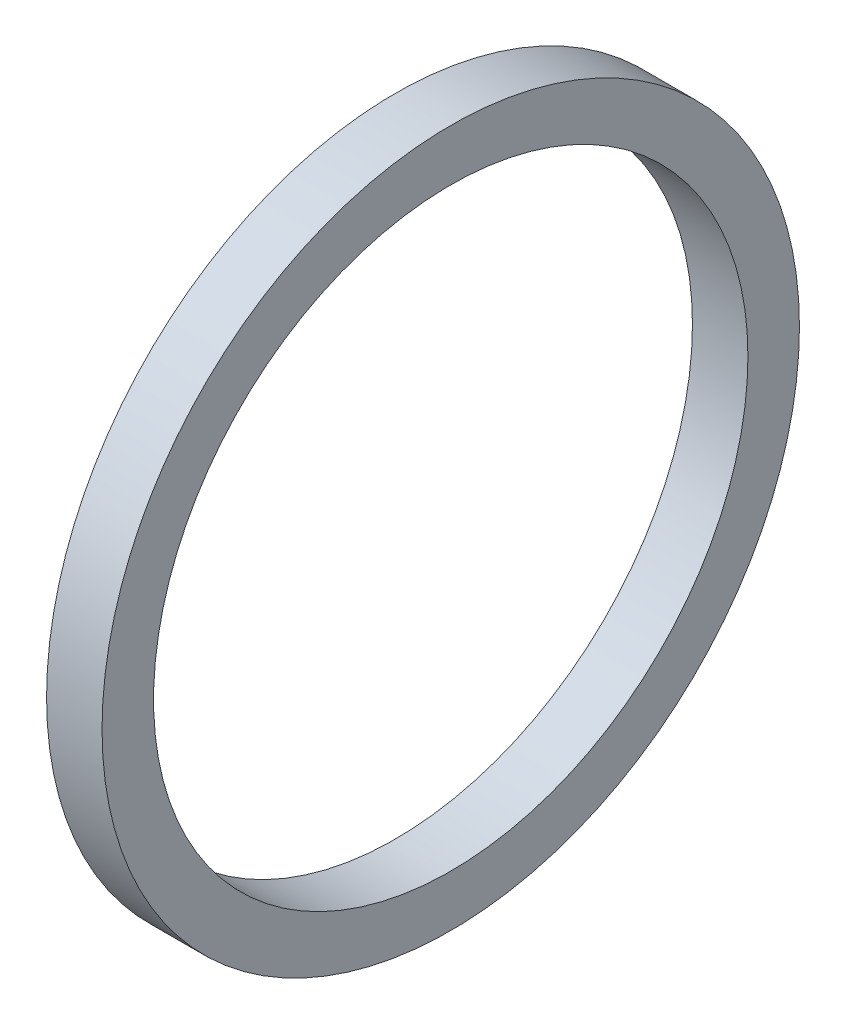
ISO-10303-21;
HEADER;
FILE_DESCRIPTION(('STEP AP214'),'2;1');
FILE_NAME('part.step','',(''),(''),'','','');
FILE_SCHEMA(('AUTOMOTIVE_DESIGN { 1 0 10303 214 1 1 1 1 }'));
ENDSEC;
DATA;
#1=APPLICATION_CONTEXT('core data for automotive mechanical design processes');
#2=APPLICATION_PROTOCOL_DEFINITION('international standard','automotive_design',2000,#1);
#3=PRODUCT_CONTEXT('',#1,'mechanical');
#4=PRODUCT('Part','Part','',(#3));
#5=PRODUCT_RELATED_PRODUCT_CATEGORY('part','',(#4));
#6=PRODUCT_DEFINITION_FORMATION('','',#4);
#7=PRODUCT_DEFINITION_CONTEXT('part definition',#1,'design');
#8=PRODUCT_DEFINITION('design','',#6,#7);
#9=PRODUCT_DEFINITION_SHAPE('','',#8);
#10=(LENGTH_UNIT() NAMED_UNIT(*) SI_UNIT(.MILLI.,.METRE.));
#11=(NAMED_UNIT(*) PLANE_ANGLE_UNIT() SI_UNIT($,.RADIAN.));
#12=(NAMED_UNIT(*) SI_UNIT($,.STERADIAN.) SOLID_ANGLE_UNIT());
#13=UNCERTAINTY_MEASURE_WITH_UNIT(LENGTH_MEASURE(1.E-05),#10,'distance_accuracy_value','');
#14=(GEOMETRIC_REPRESENTATION_CONTEXT(3) GLOBAL_UNCERTAINTY_ASSIGNED_CONTEXT((#13)) GLOBAL_UNIT_ASSIGNED_CONTEXT((#10,
#11,#12)) REPRESENTATION_CONTEXT('',''));
#15=CARTESIAN_POINT('',(0.,0.,0.));
#16=DIRECTION('',(0.,0.,1.));
#17=DIRECTION('',(1.,0.,0.));
#18=AXIS2_PLACEMENT_3D('',#15,#16,#17);
#19=CARTESIAN_POINT('',(7.,0.,0.));
#20=DIRECTION('',(1.,0.,0.));
#21=DIRECTION('',(0.,0.,-1.));
#22=AXIS2_PLACEMENT_3D('',#19,#20,#21);
#23=PLANE('',#22);
#24=CARTESIAN_POINT('',(7.,0.,0.));
#25=DIRECTION('',(1.,0.,0.));
#26=DIRECTION('',(0.,0.,-1.));
#27=AXIS2_PLACEMENT_3D('',#24,#25,#26);
#28=CIRCLE('',#27,44.);
#29=CARTESIAN_POINT('',(7.,0.,-44.));
#30=VERTEX_POINT('',#29);
#31=EDGE_CURVE('E10',#30,#30,#28,.T.);
#32=ORIENTED_EDGE('',*,*,#31,.T.);
#33=EDGE_LOOP('',(#32));
#34=FACE_BOUND('',#33,.T.);
#35=CARTESIAN_POINT('',(7.,0.,0.));
#36=DIRECTION('',(1.,0.,0.));
#37=DIRECTION('',(0.,0.,-1.));
#38=AXIS2_PLACEMENT_3D('',#35,#36,#37);
#39=CIRCLE('',#38,37.5);
#40=CARTESIAN_POINT('',(7.,0.,-37.5));
#41=VERTEX_POINT('',#40);
#42=EDGE_CURVE('E42',#41,#41,#39,.T.);
#43=ORIENTED_EDGE('',*,*,#42,.F.);
#44=EDGE_LOOP('',(#43));
#45=FACE_BOUND('',#44,.T.);
#46=ADVANCED_FACE('F31',(#34,#45),#23,.T.);
#47=CARTESIAN_POINT('',(0.,0.,0.));
#48=DIRECTION('',(1.,0.,0.));
#49=DIRECTION('',(0.,0.,-1.));
#50=AXIS2_PLACEMENT_3D('',#47,#48,#49);
#51=PLANE('',#50);
#52=CARTESIAN_POINT('',(0.,0.,0.));
#53=DIRECTION('',(1.,0.,0.));
#54=DIRECTION('',(0.,0.,-1.));
#55=AXIS2_PLACEMENT_3D('',#52,#53,#54);
#56=CIRCLE('',#55,44.);
#57=CARTESIAN_POINT('',(0.,0.,-44.));
#58=VERTEX_POINT('',#57);
#59=EDGE_CURVE('E35',#58,#58,#56,.T.);
#60=ORIENTED_EDGE('',*,*,#59,.F.);
#61=EDGE_LOOP('',(#60));
#62=FACE_BOUND('',#61,.T.);
#63=CARTESIAN_POINT('',(0.,0.,0.));
#64=DIRECTION('',(1.,0.,0.));
#65=DIRECTION('',(0.,0.,-1.));
#66=AXIS2_PLACEMENT_3D('',#63,#64,#65);
#67=CIRCLE('',#66,37.5);
#68=CARTESIAN_POINT('',(0.,0.,-37.5));
#69=VERTEX_POINT('',#68);
#70=EDGE_CURVE('E44',#69,#69,#67,.T.);
#71=ORIENTED_EDGE('',*,*,#70,.T.);
#72=EDGE_LOOP('',(#71));
#73=FACE_BOUND('',#72,.T.);
#74=ADVANCED_FACE('F54',(#62,#73),#51,.F.);
#75=CARTESIAN_POINT('',(7.,0.,0.));
#76=DIRECTION('',(-1.,0.,0.));
#77=DIRECTION('',(0.,0.,1.));
#78=AXIS2_PLACEMENT_3D('',#75,#76,#77);
#79=CYLINDRICAL_SURFACE('',#78,44.);
#80=ORIENTED_EDGE('',*,*,#31,.F.);
#81=EDGE_LOOP('',(#80));
#82=FACE_BOUND('',#81,.T.);
#83=ORIENTED_EDGE('',*,*,#59,.T.);
#84=EDGE_LOOP('',(#83));
#85=FACE_BOUND('',#84,.T.);
#86=ADVANCED_FACE('F33',(#82,#85),#79,.T.);
#87=CARTESIAN_POINT('',(7.,0.,0.));
#88=DIRECTION('',(-1.,0.,0.));
#89=DIRECTION('',(0.,0.,1.));
#90=AXIS2_PLACEMENT_3D('',#87,#88,#89);
#91=CYLINDRICAL_SURFACE('',#90,37.5);
#92=ORIENTED_EDGE('',*,*,#42,.T.);
#93=EDGE_LOOP('',(#92));
#94=FACE_BOUND('',#93,.T.);
#95=ORIENTED_EDGE('',*,*,#70,.F.);
#96=EDGE_LOOP('',(#95));
#97=FACE_BOUND('',#96,.T.);
#98=ADVANCED_FACE('F50',(#94,#97),#91,.F.);
#99=CLOSED_SHELL('',(#46,#74,#86,#98));
#100=MANIFOLD_SOLID_BREP('B2',#99);
#101=ADVANCED_BREP_SHAPE_REPRESENTATION('',(#18,#100),#14);
#102=SHAPE_DEFINITION_REPRESENTATION(#9,#101);
ENDSEC;
END-ISO-10303-21;
